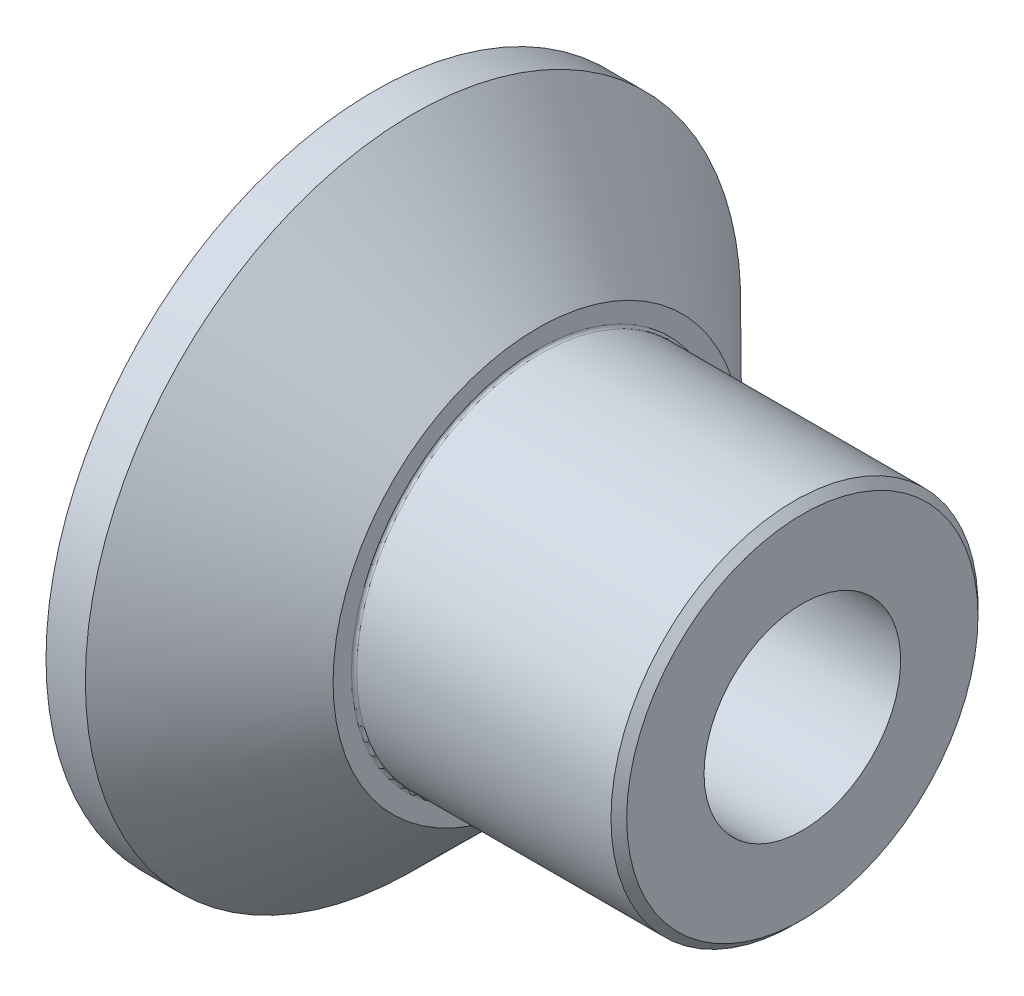
ISO-10303-21;
HEADER;
FILE_DESCRIPTION(('STEP AP214'),'2;1');
FILE_NAME('part.step','',(''),(''),'','','');
FILE_SCHEMA(('AUTOMOTIVE_DESIGN { 1 0 10303 214 1 1 1 1 }'));
ENDSEC;
DATA;
#1=APPLICATION_CONTEXT('core data for automotive mechanical design processes');
#2=APPLICATION_PROTOCOL_DEFINITION('international standard','automotive_design',2000,#1);
#3=PRODUCT_CONTEXT('',#1,'mechanical');
#4=PRODUCT('Part','Part','',(#3));
#5=PRODUCT_RELATED_PRODUCT_CATEGORY('part','',(#4));
#6=PRODUCT_DEFINITION_FORMATION('','',#4);
#7=PRODUCT_DEFINITION_CONTEXT('part definition',#1,'design');
#8=PRODUCT_DEFINITION('design','',#6,#7);
#9=PRODUCT_DEFINITION_SHAPE('','',#8);
#10=(LENGTH_UNIT() NAMED_UNIT(*) SI_UNIT(.MILLI.,.METRE.));
#11=(NAMED_UNIT(*) PLANE_ANGLE_UNIT() SI_UNIT($,.RADIAN.));
#12=(NAMED_UNIT(*) SI_UNIT($,.STERADIAN.) SOLID_ANGLE_UNIT());
#13=UNCERTAINTY_MEASURE_WITH_UNIT(LENGTH_MEASURE(1.E-05),#10,'distance_accuracy_value','');
#14=(GEOMETRIC_REPRESENTATION_CONTEXT(3) GLOBAL_UNCERTAINTY_ASSIGNED_CONTEXT((#13)) GLOBAL_UNIT_ASSIGNED_CONTEXT((#10,
#11,#12)) REPRESENTATION_CONTEXT('',''));
#15=CARTESIAN_POINT('',(0.,0.,0.));
#16=DIRECTION('',(0.,0.,1.));
#17=DIRECTION('',(1.,0.,0.));
#18=AXIS2_PLACEMENT_3D('',#15,#16,#17);
#19=CARTESIAN_POINT('',(0.,32.4999999999999,-7.7715611723761E-13));
#20=DIRECTION('',(-1.,0.,0.));
#21=DIRECTION('',(0.,0.,1.));
#22=AXIS2_PLACEMENT_3D('',#19,#20,#21);
#23=PLANE('',#22);
#24=CARTESIAN_POINT('',(4.44089209850063E-13,-37.5000000000001,-8.88178419700125E-13));
#25=DIRECTION('',(-1.,0.,0.));
#26=DIRECTION('',(0.,0.,1.));
#27=AXIS2_PLACEMENT_3D('',#24,#25,#26);
#28=CIRCLE('',#27,67.0000000000001);
#29=CARTESIAN_POINT('',(4.44089209850063E-13,-37.5000000000001,66.9999999999992));
#30=VERTEX_POINT('',#29);
#31=EDGE_CURVE('E10',#30,#30,#28,.F.);
#32=ORIENTED_EDGE('',*,*,#31,.T.);
#33=EDGE_LOOP('',(#32));
#34=FACE_BOUND('',#33,.T.);
#35=CARTESIAN_POINT('',(4.44089209850063E-13,-37.5000000000001,-8.88178419700125E-13));
#36=DIRECTION('',(-1.,0.,0.));
#37=DIRECTION('',(0.,0.,1.));
#38=AXIS2_PLACEMENT_3D('',#35,#36,#37);
#39=CIRCLE('',#38,37.5);
#40=CARTESIAN_POINT('',(4.44089209850063E-13,-37.5000000000001,37.4999999999991));
#41=VERTEX_POINT('',#40);
#42=EDGE_CURVE('E52',#41,#41,#39,.T.);
#43=ORIENTED_EDGE('',*,*,#42,.T.);
#44=EDGE_LOOP('',(#43));
#45=FACE_BOUND('',#44,.T.);
#46=ADVANCED_FACE('F32',(#34,#45),#23,.F.);
#47=CARTESIAN_POINT('',(-120.5,-37.4999999999994,-1.66533453693773E-12));
#48=DIRECTION('',(-1.,0.,0.));
#49=DIRECTION('',(0.,0.,1.));
#50=AXIS2_PLACEMENT_3D('',#47,#48,#49);
#51=CYLINDRICAL_SURFACE('',#50,37.5);
#52=ORIENTED_EDGE('',*,*,#42,.F.);
#53=EDGE_LOOP('',(#52));
#54=FACE_BOUND('',#53,.T.);
#55=CARTESIAN_POINT('',(-120.5,-37.4999999999994,-1.66533453693773E-12));
#56=DIRECTION('',(-1.,0.,0.));
#57=DIRECTION('',(0.,0.,1.));
#58=AXIS2_PLACEMENT_3D('',#55,#56,#57);
#59=CIRCLE('',#58,37.5);
#60=CARTESIAN_POINT('',(-120.5,-37.4999999999994,37.4999999999983));
#61=VERTEX_POINT('',#60);
#62=EDGE_CURVE('E55',#61,#61,#59,.T.);
#63=ORIENTED_EDGE('',*,*,#62,.T.);
#64=EDGE_LOOP('',(#63));
#65=FACE_BOUND('',#64,.T.);
#66=ADVANCED_FACE('F91',(#54,#65),#51,.F.);
#67=CARTESIAN_POINT('',(-120.5,4.44089209850063E-13,-9.43689570931383E-13));
#68=DIRECTION('',(1.,0.,0.));
#69=DIRECTION('',(0.,0.,-1.));
#70=AXIS2_PLACEMENT_3D('',#67,#68,#69);
#71=PLANE('',#70);
#72=ORIENTED_EDGE('',*,*,#62,.F.);
#73=EDGE_LOOP('',(#72));
#74=FACE_BOUND('',#73,.T.);
#75=CARTESIAN_POINT('',(-120.5,-37.4999999999994,-1.66533453693773E-12));
#76=DIRECTION('',(-1.,0.,0.));
#77=DIRECTION('',(0.,0.,1.));
#78=AXIS2_PLACEMENT_3D('',#75,#76,#77);
#79=CIRCLE('',#78,55.);
#80=CARTESIAN_POINT('',(-120.5,-37.4999999999994,54.9999999999983));
#81=VERTEX_POINT('',#80);
#82=EDGE_CURVE('E58',#81,#81,#79,.T.);
#83=ORIENTED_EDGE('',*,*,#82,.T.);
#84=EDGE_LOOP('',(#83));
#85=FACE_BOUND('',#84,.T.);
#86=ADVANCED_FACE('F96',(#74,#85),#71,.F.);
#87=CARTESIAN_POINT('',(-163.5,-37.4999999999998,-1.4432899320127E-12));
#88=DIRECTION('',(-1.,0.,0.));
#89=DIRECTION('',(0.,0.,1.));
#90=AXIS2_PLACEMENT_3D('',#87,#88,#89);
#91=CONICAL_SURFACE('',#90,110.,0.907240600417365);
#92=ORIENTED_EDGE('',*,*,#82,.F.);
#93=EDGE_LOOP('',(#92));
#94=FACE_BOUND('',#93,.T.);
#95=CARTESIAN_POINT('',(-163.5,-37.4999999999998,-1.4432899320127E-12));
#96=DIRECTION('',(-1.,0.,0.));
#97=DIRECTION('',(0.,0.,1.));
#98=AXIS2_PLACEMENT_3D('',#95,#96,#97);
#99=CIRCLE('',#98,110.);
#100=CARTESIAN_POINT('',(-163.5,-37.4999999999998,109.999999999999));
#101=VERTEX_POINT('',#100);
#102=EDGE_CURVE('E61',#101,#101,#99,.T.);
#103=ORIENTED_EDGE('',*,*,#102,.T.);
#104=EDGE_LOOP('',(#103));
#105=FACE_BOUND('',#104,.T.);
#106=ADVANCED_FACE('F153',(#94,#105),#91,.F.);
#107=CARTESIAN_POINT('',(-163.5,72.5000000000002,-1.0547118733939E-12));
#108=DIRECTION('',(1.,0.,0.));
#109=DIRECTION('',(0.,0.,-1.));
#110=AXIS2_PLACEMENT_3D('',#107,#108,#109);
#111=PLANE('',#110);
#112=ORIENTED_EDGE('',*,*,#102,.F.);
#113=EDGE_LOOP('',(#112));
#114=FACE_BOUND('',#113,.T.);
#115=CARTESIAN_POINT('',(-163.5,-37.4999999999998,-1.4432899320127E-12));
#116=DIRECTION('',(-1.,0.,0.));
#117=DIRECTION('',(0.,0.,1.));
#118=AXIS2_PLACEMENT_3D('',#115,#116,#117);
#119=CIRCLE('',#118,125.);
#120=CARTESIAN_POINT('',(-163.5,-37.4999999999998,124.999999999999));
#121=VERTEX_POINT('',#120);
#122=EDGE_CURVE('E64',#121,#121,#119,.T.);
#123=ORIENTED_EDGE('',*,*,#122,.T.);
#124=EDGE_LOOP('',(#123));
#125=FACE_BOUND('',#124,.T.);
#126=ADVANCED_FACE('F143',(#114,#125),#111,.F.);
#127=CARTESIAN_POINT('',(-120.5,-37.4999999999994,-1.66533453693773E-12));
#128=DIRECTION('',(-1.,0.,0.));
#129=DIRECTION('',(0.,0.,1.));
#130=AXIS2_PLACEMENT_3D('',#127,#128,#129);
#131=CYLINDRICAL_SURFACE('',#130,125.);
#132=ORIENTED_EDGE('',*,*,#122,.F.);
#133=EDGE_LOOP('',(#132));
#134=FACE_BOUND('',#133,.T.);
#135=CARTESIAN_POINT('',(-148.5,-37.5,-8.32667268468867E-13));
#136=DIRECTION('',(-1.,0.,0.));
#137=DIRECTION('',(0.,0.,1.));
#138=AXIS2_PLACEMENT_3D('',#135,#136,#137);
#139=CIRCLE('',#138,125.);
#140=CARTESIAN_POINT('',(-148.5,-37.5,124.999999999999));
#141=VERTEX_POINT('',#140);
#142=EDGE_CURVE('E67',#141,#141,#139,.T.);
#143=ORIENTED_EDGE('',*,*,#142,.T.);
#144=EDGE_LOOP('',(#143));
#145=FACE_BOUND('',#144,.T.);
#146=ADVANCED_FACE('F87',(#134,#145),#131,.T.);
#147=CARTESIAN_POINT('',(-101.,-37.4999999999996,-1.22124532708767E-12));
#148=DIRECTION('',(-1.,0.,0.));
#149=DIRECTION('',(0.,0.,1.));
#150=AXIS2_PLACEMENT_3D('',#147,#148,#149);
#151=CONICAL_SURFACE('',#150,78.,0.780107207479047);
#152=ORIENTED_EDGE('',*,*,#142,.F.);
#153=EDGE_LOOP('',(#152));
#154=FACE_BOUND('',#153,.T.);
#155=CARTESIAN_POINT('',(-101.,-37.4999999999996,-1.22124532708767E-12));
#156=DIRECTION('',(-1.,0.,0.));
#157=DIRECTION('',(0.,0.,1.));
#158=AXIS2_PLACEMENT_3D('',#155,#156,#157);
#159=CIRCLE('',#158,78.);
#160=CARTESIAN_POINT('',(-101.,-37.4999999999996,77.9999999999988));
#161=VERTEX_POINT('',#160);
#162=EDGE_CURVE('E70',#161,#161,#159,.T.);
#163=ORIENTED_EDGE('',*,*,#162,.T.);
#164=EDGE_LOOP('',(#163));
#165=FACE_BOUND('',#164,.T.);
#166=ADVANCED_FACE('F74',(#154,#165),#151,.T.);
#167=CARTESIAN_POINT('',(-101.,40.5000000000001,-1.22124532708767E-12));
#168=DIRECTION('',(-1.,0.,0.));
#169=DIRECTION('',(0.,0.,1.));
#170=AXIS2_PLACEMENT_3D('',#167,#168,#169);
#171=PLANE('',#170);
#172=CARTESIAN_POINT('',(-101.,-37.4999999999996,-1.22124532708767E-12));
#173=DIRECTION('',(-1.,0.,0.));
#174=DIRECTION('',(0.,0.,1.));
#175=AXIS2_PLACEMENT_3D('',#172,#173,#174);
#176=CIRCLE('',#175,71.);
#177=CARTESIAN_POINT('',(-101.,-37.4999999999996,70.9999999999988));
#178=VERTEX_POINT('',#177);
#179=EDGE_CURVE('E47',#178,#178,#176,.T.);
#180=ORIENTED_EDGE('',*,*,#179,.T.);
#181=EDGE_LOOP('',(#180));
#182=FACE_BOUND('',#181,.T.);
#183=ORIENTED_EDGE('',*,*,#162,.F.);
#184=EDGE_LOOP('',(#183));
#185=FACE_BOUND('',#184,.T.);
#186=ADVANCED_FACE('F76',(#182,#185),#171,.F.);
#187=CARTESIAN_POINT('',(-120.5,-37.4999999999994,-1.66533453693773E-12));
#188=DIRECTION('',(-1.,0.,0.));
#189=DIRECTION('',(0.,0.,1.));
#190=AXIS2_PLACEMENT_3D('',#187,#188,#189);
#191=CYLINDRICAL_SURFACE('',#190,70.);
#192=CARTESIAN_POINT('',(-2.99999999999945,-37.4999999999994,-1.27675647831893E-12));
#193=DIRECTION('',(-1.,0.,0.));
#194=DIRECTION('',(0.,0.,1.));
#195=AXIS2_PLACEMENT_3D('',#192,#193,#194);
#196=CIRCLE('',#195,70.);
#197=CARTESIAN_POINT('',(-2.99999999999945,-37.4999999999994,69.9999999999987));
#198=VERTEX_POINT('',#197);
#199=EDGE_CURVE('E39',#198,#198,#196,.T.);
#200=ORIENTED_EDGE('',*,*,#199,.T.);
#201=EDGE_LOOP('',(#200));
#202=FACE_BOUND('',#201,.T.);
#203=CARTESIAN_POINT('',(-100.,-37.4999999999996,-1.55431223447522E-12));
#204=DIRECTION('',(-1.,0.,0.));
#205=DIRECTION('',(0.,0.,1.));
#206=AXIS2_PLACEMENT_3D('',#203,#204,#205);
#207=CIRCLE('',#206,70.);
#208=CARTESIAN_POINT('',(-100.,-37.4999999999996,69.9999999999985));
#209=VERTEX_POINT('',#208);
#210=EDGE_CURVE('E43',#209,#209,#207,.F.);
#211=ORIENTED_EDGE('',*,*,#210,.T.);
#212=EDGE_LOOP('',(#211));
#213=FACE_BOUND('',#212,.T.);
#214=ADVANCED_FACE('F78',(#202,#213),#191,.T.);
#215=CARTESIAN_POINT('',(-100.,-37.4999999999996,-1.55431223447522E-12));
#216=DIRECTION('',(-1.,0.,0.));
#217=DIRECTION('',(0.,0.,1.));
#218=AXIS2_PLACEMENT_3D('',#215,#216,#217);
#219=TOROIDAL_SURFACE('',#218,71.,1.);
#220=ORIENTED_EDGE('',*,*,#210,.F.);
#221=EDGE_LOOP('',(#220));
#222=FACE_BOUND('',#221,.T.);
#223=ORIENTED_EDGE('',*,*,#179,.F.);
#224=EDGE_LOOP('',(#223));
#225=FACE_BOUND('',#224,.T.);
#226=ADVANCED_FACE('F85',(#222,#225),#219,.F.);
#227=CARTESIAN_POINT('',(-2.99999999999945,-37.4999999999994,-1.27675647831893E-12));
#228=DIRECTION('',(-1.,0.,0.));
#229=DIRECTION('',(0.,0.,1.));
#230=AXIS2_PLACEMENT_3D('',#227,#228,#229);
#231=CONICAL_SURFACE('',#230,70.,0.785398163397453);
#232=ORIENTED_EDGE('',*,*,#31,.F.);
#233=EDGE_LOOP('',(#232));
#234=FACE_BOUND('',#233,.T.);
#235=ORIENTED_EDGE('',*,*,#199,.F.);
#236=EDGE_LOOP('',(#235));
#237=FACE_BOUND('',#236,.T.);
#238=ADVANCED_FACE('F34',(#234,#237),#231,.T.);
#239=CLOSED_SHELL('',(#46,#66,#86,#106,#126,#146,#166,#186,#214,#226,#238));
#240=MANIFOLD_SOLID_BREP('B2',#239);
#241=ADVANCED_BREP_SHAPE_REPRESENTATION('',(#18,#240),#14);
#242=SHAPE_DEFINITION_REPRESENTATION(#9,#241);
ENDSEC;
END-ISO-10303-21;
